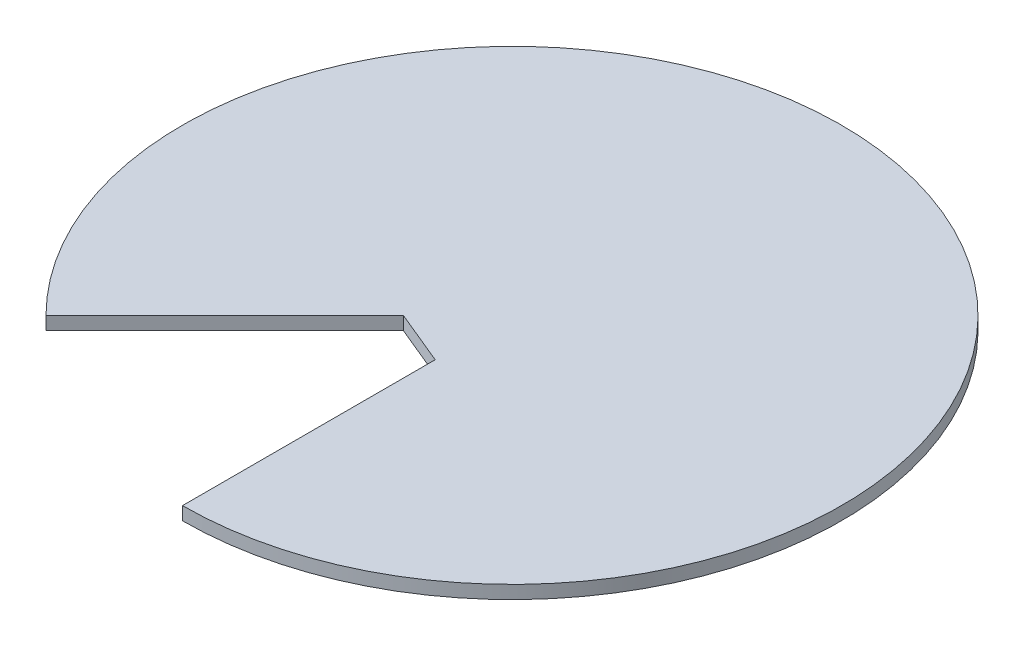
ISO-10303-21;
HEADER;
FILE_DESCRIPTION(('STEP AP214'),'2;1');
FILE_NAME('part.step','',(''),(''),'','','');
FILE_SCHEMA(('AUTOMOTIVE_DESIGN { 1 0 10303 214 1 1 1 1 }'));
ENDSEC;
DATA;
#1=APPLICATION_CONTEXT('core data for automotive mechanical design processes');
#2=APPLICATION_PROTOCOL_DEFINITION('international standard','automotive_design',2000,#1);
#3=PRODUCT_CONTEXT('',#1,'mechanical');
#4=PRODUCT('Part','Part','',(#3));
#5=PRODUCT_RELATED_PRODUCT_CATEGORY('part','',(#4));
#6=PRODUCT_DEFINITION_FORMATION('','',#4);
#7=PRODUCT_DEFINITION_CONTEXT('part definition',#1,'design');
#8=PRODUCT_DEFINITION('design','',#6,#7);
#9=PRODUCT_DEFINITION_SHAPE('','',#8);
#10=(LENGTH_UNIT() NAMED_UNIT(*) SI_UNIT(.MILLI.,.METRE.));
#11=(NAMED_UNIT(*) PLANE_ANGLE_UNIT() SI_UNIT($,.RADIAN.));
#12=(NAMED_UNIT(*) SI_UNIT($,.STERADIAN.) SOLID_ANGLE_UNIT());
#13=UNCERTAINTY_MEASURE_WITH_UNIT(LENGTH_MEASURE(1.E-05),#10,'distance_accuracy_value','');
#14=(GEOMETRIC_REPRESENTATION_CONTEXT(3) GLOBAL_UNCERTAINTY_ASSIGNED_CONTEXT((#13)) GLOBAL_UNIT_ASSIGNED_CONTEXT((#10,
#11,#12)) REPRESENTATION_CONTEXT('',''));
#15=CARTESIAN_POINT('',(0.,0.,0.));
#16=DIRECTION('',(0.,0.,1.));
#17=DIRECTION('',(1.,0.,0.));
#18=AXIS2_PLACEMENT_3D('',#15,#16,#17);
#19=CARTESIAN_POINT('',(0.,3.,0.));
#20=DIRECTION('',(0.,-1.,0.));
#21=DIRECTION('',(0.,0.,-1.));
#22=AXIS2_PLACEMENT_3D('',#19,#20,#21);
#23=CYLINDRICAL_SURFACE('',#22,75.);
#24=CARTESIAN_POINT('',(0.,0.,0.));
#25=DIRECTION('',(0.,1.,0.));
#26=DIRECTION('',(0.,0.,1.));
#27=AXIS2_PLACEMENT_3D('',#24,#25,#26);
#28=CIRCLE('',#27,75.);
#29=CARTESIAN_POINT('',(0.,0.,75.));
#30=VERTEX_POINT('',#29);
#31=CARTESIAN_POINT('',(-53.033008588991,0.,53.033008588991));
#32=VERTEX_POINT('',#31);
#33=EDGE_CURVE('E36',#30,#32,#28,.T.);
#34=ORIENTED_EDGE('',*,*,#33,.T.);
#35=DIRECTION('',(0.,1.,0.));
#36=VECTOR('',#35,1.);
#37=CARTESIAN_POINT('',(-53.033008588991,0.,53.033008588991));
#38=LINE('',#37,#36);
#39=CARTESIAN_POINT('',(-53.033008588991,3.,53.033008588991));
#40=VERTEX_POINT('',#39);
#41=EDGE_CURVE('E56',#32,#40,#38,.T.);
#42=ORIENTED_EDGE('',*,*,#41,.T.);
#43=CARTESIAN_POINT('',(0.,3.,0.));
#44=DIRECTION('',(0.,1.,0.));
#45=DIRECTION('',(0.,0.,1.));
#46=AXIS2_PLACEMENT_3D('',#43,#44,#45);
#47=CIRCLE('',#46,75.);
#48=CARTESIAN_POINT('',(0.,3.,75.));
#49=VERTEX_POINT('',#48);
#50=EDGE_CURVE('E11',#49,#40,#47,.T.);
#51=ORIENTED_EDGE('',*,*,#50,.F.);
#52=DIRECTION('',(0.,1.,0.));
#53=VECTOR('',#52,1.);
#54=CARTESIAN_POINT('',(0.,0.,75.));
#55=LINE('',#54,#53);
#56=EDGE_CURVE('E79',#30,#49,#55,.T.);
#57=ORIENTED_EDGE('',*,*,#56,.F.);
#58=EDGE_LOOP('',(#34,#42,#51,#57));
#59=FACE_BOUND('',#58,.T.);
#60=ADVANCED_FACE('F33',(#59),#23,.T.);
#61=CARTESIAN_POINT('',(0.,3.,0.));
#62=DIRECTION('',(0.,1.,0.));
#63=DIRECTION('',(0.,0.,1.));
#64=AXIS2_PLACEMENT_3D('',#61,#62,#63);
#65=PLANE('',#64);
#66=DIRECTION('',(-0.707106781186547,0.,0.707106781186548));
#67=VECTOR('',#66,1.);
#68=CARTESIAN_POINT('',(-53.033008588991,3.,53.033008588991));
#69=LINE('',#68,#67);
#70=CARTESIAN_POINT('',(-12.3663204826922,3.,12.3663204826922));
#71=VERTEX_POINT('',#70);
#72=EDGE_CURVE('E71',#71,#40,#69,.T.);
#73=ORIENTED_EDGE('',*,*,#72,.F.);
#74=DIRECTION('',(-0.923879532511287,0.,-0.382683432365089));
#75=VECTOR('',#74,1.);
#76=CARTESIAN_POINT('',(-12.3663204826922,3.,12.3663204826922));
#77=LINE('',#76,#75);
#78=CARTESIAN_POINT('',(0.,3.,17.4886181432755));
#79=VERTEX_POINT('',#78);
#80=EDGE_CURVE('E100',#79,#71,#77,.T.);
#81=ORIENTED_EDGE('',*,*,#80,.F.);
#82=DIRECTION('',(0.,0.,-1.));
#83=VECTOR('',#82,1.);
#84=CARTESIAN_POINT('',(0.,3.,17.4886181432755));
#85=LINE('',#84,#83);
#86=EDGE_CURVE('E101',#49,#79,#85,.T.);
#87=ORIENTED_EDGE('',*,*,#86,.F.);
#88=ORIENTED_EDGE('',*,*,#50,.T.);
#89=EDGE_LOOP('',(#73,#81,#87,#88));
#90=FACE_BOUND('',#89,.T.);
#91=ADVANCED_FACE('F104',(#90),#65,.T.);
#92=CARTESIAN_POINT('',(0.,0.,0.));
#93=DIRECTION('',(0.,1.,0.));
#94=DIRECTION('',(0.,0.,1.));
#95=AXIS2_PLACEMENT_3D('',#92,#93,#94);
#96=PLANE('',#95);
#97=DIRECTION('',(-0.923879532511287,0.,-0.382683432365089));
#98=VECTOR('',#97,1.);
#99=CARTESIAN_POINT('',(-12.3663204826922,0.,12.3663204826922));
#100=LINE('',#99,#98);
#101=CARTESIAN_POINT('',(0.,0.,17.4886181432755));
#102=VERTEX_POINT('',#101);
#103=CARTESIAN_POINT('',(-12.3663204826922,0.,12.3663204826922));
#104=VERTEX_POINT('',#103);
#105=EDGE_CURVE('E47',#102,#104,#100,.T.);
#106=ORIENTED_EDGE('',*,*,#105,.T.);
#107=DIRECTION('',(-0.707106781186547,0.,0.707106781186548));
#108=VECTOR('',#107,1.);
#109=CARTESIAN_POINT('',(-53.033008588991,0.,53.033008588991));
#110=LINE('',#109,#108);
#111=EDGE_CURVE('E88',#104,#32,#110,.T.);
#112=ORIENTED_EDGE('',*,*,#111,.T.);
#113=ORIENTED_EDGE('',*,*,#33,.F.);
#114=DIRECTION('',(0.,0.,-1.));
#115=VECTOR('',#114,1.);
#116=CARTESIAN_POINT('',(0.,0.,17.4886181432755));
#117=LINE('',#116,#115);
#118=EDGE_CURVE('E75',#30,#102,#117,.T.);
#119=ORIENTED_EDGE('',*,*,#118,.T.);
#120=EDGE_LOOP('',(#106,#112,#113,#119));
#121=FACE_BOUND('',#120,.T.);
#122=ADVANCED_FACE('F90',(#121),#96,.F.);
#123=CARTESIAN_POINT('',(-53.033008588991,0.,53.033008588991));
#124=DIRECTION('',(-0.707106781186548,0.,-0.707106781186547));
#125=DIRECTION('',(-0.707106781186547,0.,0.707106781186548));
#126=AXIS2_PLACEMENT_3D('',#123,#124,#125);
#127=PLANE('',#126);
#128=ORIENTED_EDGE('',*,*,#72,.T.);
#129=ORIENTED_EDGE('',*,*,#41,.F.);
#130=ORIENTED_EDGE('',*,*,#111,.F.);
#131=DIRECTION('',(0.,1.,0.));
#132=VECTOR('',#131,1.);
#133=CARTESIAN_POINT('',(-12.3663204826922,0.,12.3663204826922));
#134=LINE('',#133,#132);
#135=EDGE_CURVE('E91',#104,#71,#134,.T.);
#136=ORIENTED_EDGE('',*,*,#135,.T.);
#137=EDGE_LOOP('',(#128,#129,#130,#136));
#138=FACE_BOUND('',#137,.T.);
#139=ADVANCED_FACE('F113',(#138),#127,.F.);
#140=CARTESIAN_POINT('',(-12.3663204826922,0.,12.3663204826922));
#141=DIRECTION('',(0.382683432365089,0.,-0.923879532511287));
#142=DIRECTION('',(-0.923879532511287,0.,-0.382683432365089));
#143=AXIS2_PLACEMENT_3D('',#140,#141,#142);
#144=PLANE('',#143);
#145=ORIENTED_EDGE('',*,*,#80,.T.);
#146=ORIENTED_EDGE('',*,*,#135,.F.);
#147=ORIENTED_EDGE('',*,*,#105,.F.);
#148=DIRECTION('',(0.,1.,0.));
#149=VECTOR('',#148,1.);
#150=CARTESIAN_POINT('',(0.,0.,17.4886181432755));
#151=LINE('',#150,#149);
#152=EDGE_CURVE('E81',#102,#79,#151,.T.);
#153=ORIENTED_EDGE('',*,*,#152,.T.);
#154=EDGE_LOOP('',(#145,#146,#147,#153));
#155=FACE_BOUND('',#154,.T.);
#156=ADVANCED_FACE('F98',(#155),#144,.F.);
#157=CARTESIAN_POINT('',(0.,0.,17.4886181432755));
#158=DIRECTION('',(1.,0.,0.));
#159=DIRECTION('',(0.,0.,-1.));
#160=AXIS2_PLACEMENT_3D('',#157,#158,#159);
#161=PLANE('',#160);
#162=ORIENTED_EDGE('',*,*,#86,.T.);
#163=ORIENTED_EDGE('',*,*,#152,.F.);
#164=ORIENTED_EDGE('',*,*,#118,.F.);
#165=ORIENTED_EDGE('',*,*,#56,.T.);
#166=EDGE_LOOP('',(#162,#163,#164,#165));
#167=FACE_BOUND('',#166,.T.);
#168=ADVANCED_FACE('F78',(#167),#161,.F.);
#169=CLOSED_SHELL('',(#60,#91,#122,#139,#156,#168));
#170=MANIFOLD_SOLID_BREP('B2',#169);
#171=ADVANCED_BREP_SHAPE_REPRESENTATION('',(#18,#170),#14);
#172=SHAPE_DEFINITION_REPRESENTATION(#9,#171);
ENDSEC;
END-ISO-10303-21;
